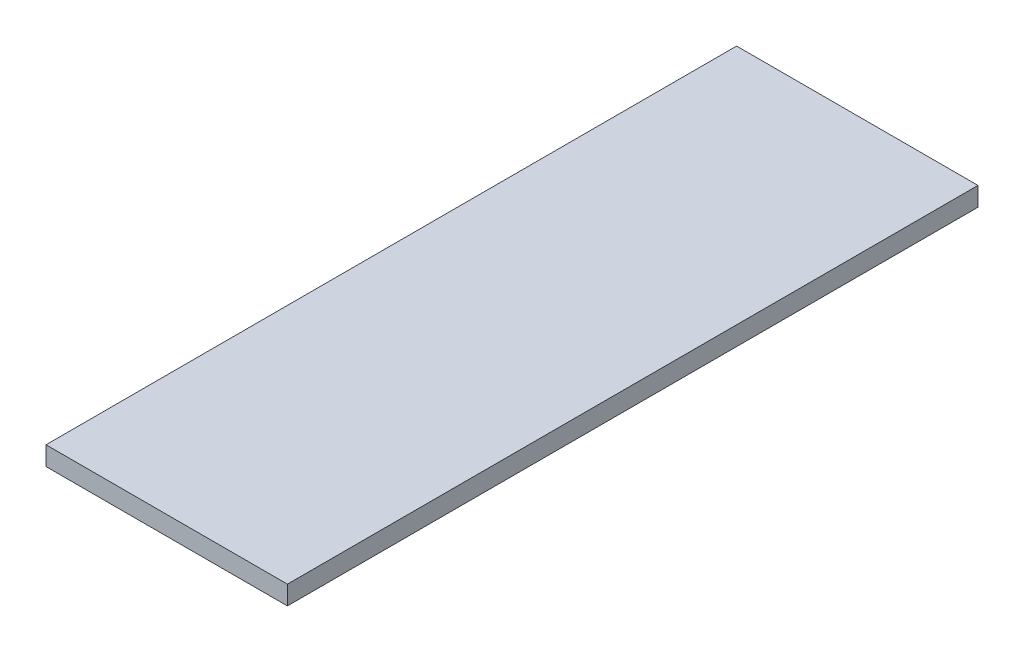
ISO-10303-21;
HEADER;
FILE_DESCRIPTION(('STEP AP214'),'2;1');
FILE_NAME('part.step','',(''),(''),'','','');
FILE_SCHEMA(('AUTOMOTIVE_DESIGN { 1 0 10303 214 1 1 1 1 }'));
ENDSEC;
DATA;
#1=APPLICATION_CONTEXT('core data for automotive mechanical design processes');
#2=APPLICATION_PROTOCOL_DEFINITION('international standard','automotive_design',2000,#1);
#3=PRODUCT_CONTEXT('',#1,'mechanical');
#4=PRODUCT('Part','Part','',(#3));
#5=PRODUCT_RELATED_PRODUCT_CATEGORY('part','',(#4));
#6=PRODUCT_DEFINITION_FORMATION('','',#4);
#7=PRODUCT_DEFINITION_CONTEXT('part definition',#1,'design');
#8=PRODUCT_DEFINITION('design','',#6,#7);
#9=PRODUCT_DEFINITION_SHAPE('','',#8);
#10=(LENGTH_UNIT() NAMED_UNIT(*) SI_UNIT(.MILLI.,.METRE.));
#11=(NAMED_UNIT(*) PLANE_ANGLE_UNIT() SI_UNIT($,.RADIAN.));
#12=(NAMED_UNIT(*) SI_UNIT($,.STERADIAN.) SOLID_ANGLE_UNIT());
#13=UNCERTAINTY_MEASURE_WITH_UNIT(LENGTH_MEASURE(1.E-05),#10,'distance_accuracy_value','');
#14=(GEOMETRIC_REPRESENTATION_CONTEXT(3) GLOBAL_UNCERTAINTY_ASSIGNED_CONTEXT((#13)) GLOBAL_UNIT_ASSIGNED_CONTEXT((#10,
#11,#12)) REPRESENTATION_CONTEXT('',''));
#15=CARTESIAN_POINT('',(0.,0.,0.));
#16=DIRECTION('',(0.,0.,1.));
#17=DIRECTION('',(1.,0.,0.));
#18=AXIS2_PLACEMENT_3D('',#15,#16,#17);
#19=CARTESIAN_POINT('',(18.,22.86,-650.));
#20=DIRECTION('',(1.,0.,0.));
#21=DIRECTION('',(0.,0.,-1.));
#22=AXIS2_PLACEMENT_3D('',#19,#20,#21);
#23=PLANE('',#22);
#24=DIRECTION('',(0.,1.,0.));
#25=VECTOR('',#24,1.);
#26=CARTESIAN_POINT('',(18.,22.86,0.));
#27=LINE('',#26,#25);
#28=CARTESIAN_POINT('',(18.,22.86,0.));
#29=VERTEX_POINT('',#28);
#30=CARTESIAN_POINT('',(18.,40.86,0.));
#31=VERTEX_POINT('',#30);
#32=EDGE_CURVE('E77',#29,#31,#27,.T.);
#33=ORIENTED_EDGE('',*,*,#32,.F.);
#34=DIRECTION('',(0.,0.,1.));
#35=VECTOR('',#34,1.);
#36=CARTESIAN_POINT('',(18.,22.86,-650.));
#37=LINE('',#36,#35);
#38=CARTESIAN_POINT('',(18.,22.86,-657.999999999975));
#39=VERTEX_POINT('',#38);
#40=EDGE_CURVE('E11',#39,#29,#37,.T.);
#41=ORIENTED_EDGE('',*,*,#40,.F.);
#42=DIRECTION('',(0.,1.,0.));
#43=VECTOR('',#42,1.);
#44=CARTESIAN_POINT('',(18.,22.86,-657.999999999975));
#45=LINE('',#44,#43);
#46=CARTESIAN_POINT('',(18.,40.86,-657.999999999975));
#47=VERTEX_POINT('',#46);
#48=EDGE_CURVE('E75',#39,#47,#45,.T.);
#49=ORIENTED_EDGE('',*,*,#48,.T.);
#50=DIRECTION('',(0.,0.,1.));
#51=VECTOR('',#50,1.);
#52=CARTESIAN_POINT('',(18.,40.86,-650.));
#53=LINE('',#52,#51);
#54=EDGE_CURVE('E37',#47,#31,#53,.T.);
#55=ORIENTED_EDGE('',*,*,#54,.T.);
#56=EDGE_LOOP('',(#33,#41,#49,#55));
#57=FACE_BOUND('',#56,.T.);
#58=ADVANCED_FACE('F34',(#57),#23,.T.);
#59=CARTESIAN_POINT('',(18.,22.86,-650.));
#60=DIRECTION('',(0.,-1.,0.));
#61=DIRECTION('',(1.,0.,0.));
#62=AXIS2_PLACEMENT_3D('',#59,#60,#61);
#63=PLANE('',#62);
#64=DIRECTION('',(1.,0.,0.));
#65=VECTOR('',#64,1.);
#66=CARTESIAN_POINT('',(18.,22.86,0.));
#67=LINE('',#66,#65);
#68=CARTESIAN_POINT('',(-212.,22.86,0.));
#69=VERTEX_POINT('',#68);
#70=EDGE_CURVE('E100',#69,#29,#67,.T.);
#71=ORIENTED_EDGE('',*,*,#70,.F.);
#72=DIRECTION('',(0.,0.,1.));
#73=VECTOR('',#72,1.);
#74=CARTESIAN_POINT('',(-212.,22.86,-650.));
#75=LINE('',#74,#73);
#76=CARTESIAN_POINT('',(-212.,22.86,-657.999999999975));
#77=VERTEX_POINT('',#76);
#78=EDGE_CURVE('E42',#77,#69,#75,.T.);
#79=ORIENTED_EDGE('',*,*,#78,.F.);
#80=DIRECTION('',(1.,0.,0.));
#81=VECTOR('',#80,1.);
#82=CARTESIAN_POINT('',(-212.,22.86,-657.999999999975));
#83=LINE('',#82,#81);
#84=EDGE_CURVE('E84',#77,#39,#83,.T.);
#85=ORIENTED_EDGE('',*,*,#84,.T.);
#86=ORIENTED_EDGE('',*,*,#40,.T.);
#87=EDGE_LOOP('',(#71,#79,#85,#86));
#88=FACE_BOUND('',#87,.T.);
#89=ADVANCED_FACE('F88',(#88),#63,.T.);
#90=CARTESIAN_POINT('',(-212.,22.86,-650.));
#91=DIRECTION('',(-1.,0.,0.));
#92=DIRECTION('',(0.,0.,1.));
#93=AXIS2_PLACEMENT_3D('',#90,#91,#92);
#94=PLANE('',#93);
#95=DIRECTION('',(0.,-1.,0.));
#96=VECTOR('',#95,1.);
#97=CARTESIAN_POINT('',(-212.,22.86,0.));
#98=LINE('',#97,#96);
#99=CARTESIAN_POINT('',(-212.,40.86,0.));
#100=VERTEX_POINT('',#99);
#101=EDGE_CURVE('E98',#100,#69,#98,.T.);
#102=ORIENTED_EDGE('',*,*,#101,.F.);
#103=DIRECTION('',(0.,0.,1.));
#104=VECTOR('',#103,1.);
#105=CARTESIAN_POINT('',(-212.,40.86,-650.));
#106=LINE('',#105,#104);
#107=CARTESIAN_POINT('',(-212.,40.86,-657.999999999975));
#108=VERTEX_POINT('',#107);
#109=EDGE_CURVE('E102',#108,#100,#106,.T.);
#110=ORIENTED_EDGE('',*,*,#109,.F.);
#111=DIRECTION('',(0.,-1.,0.));
#112=VECTOR('',#111,1.);
#113=CARTESIAN_POINT('',(-212.,22.86,-657.999999999975));
#114=LINE('',#113,#112);
#115=EDGE_CURVE('E92',#108,#77,#114,.T.);
#116=ORIENTED_EDGE('',*,*,#115,.T.);
#117=ORIENTED_EDGE('',*,*,#78,.T.);
#118=EDGE_LOOP('',(#102,#110,#116,#117));
#119=FACE_BOUND('',#118,.T.);
#120=ADVANCED_FACE('F108',(#119),#94,.T.);
#121=CARTESIAN_POINT('',(18.,40.86,-650.));
#122=DIRECTION('',(0.,1.,0.));
#123=DIRECTION('',(-1.,0.,0.));
#124=AXIS2_PLACEMENT_3D('',#121,#122,#123);
#125=PLANE('',#124);
#126=DIRECTION('',(-1.,0.,0.));
#127=VECTOR('',#126,1.);
#128=CARTESIAN_POINT('',(18.,40.86,0.));
#129=LINE('',#128,#127);
#130=EDGE_CURVE('E95',#31,#100,#129,.T.);
#131=ORIENTED_EDGE('',*,*,#130,.F.);
#132=ORIENTED_EDGE('',*,*,#54,.F.);
#133=DIRECTION('',(-1.,0.,0.));
#134=VECTOR('',#133,1.);
#135=CARTESIAN_POINT('',(-212.,40.86,-657.999999999975));
#136=LINE('',#135,#134);
#137=EDGE_CURVE('E86',#47,#108,#136,.T.);
#138=ORIENTED_EDGE('',*,*,#137,.T.);
#139=ORIENTED_EDGE('',*,*,#109,.T.);
#140=EDGE_LOOP('',(#131,#132,#138,#139));
#141=FACE_BOUND('',#140,.T.);
#142=ADVANCED_FACE('F105',(#141),#125,.T.);
#143=CARTESIAN_POINT('',(0.,0.,0.));
#144=DIRECTION('',(0.,0.,1.));
#145=DIRECTION('',(1.,0.,0.));
#146=AXIS2_PLACEMENT_3D('',#143,#144,#145);
#147=PLANE('',#146);
#148=ORIENTED_EDGE('',*,*,#32,.T.);
#149=ORIENTED_EDGE('',*,*,#130,.T.);
#150=ORIENTED_EDGE('',*,*,#101,.T.);
#151=ORIENTED_EDGE('',*,*,#70,.T.);
#152=EDGE_LOOP('',(#148,#149,#150,#151));
#153=FACE_BOUND('',#152,.T.);
#154=ADVANCED_FACE('F107',(#153),#147,.T.);
#155=CARTESIAN_POINT('',(-12.7000000000002,-10.5,-657.999999999975));
#156=DIRECTION('',(0.,0.,1.));
#157=DIRECTION('',(0.,1.,0.));
#158=AXIS2_PLACEMENT_3D('',#155,#156,#157);
#159=PLANE('',#158);
#160=ORIENTED_EDGE('',*,*,#137,.F.);
#161=ORIENTED_EDGE('',*,*,#48,.F.);
#162=ORIENTED_EDGE('',*,*,#84,.F.);
#163=ORIENTED_EDGE('',*,*,#115,.F.);
#164=EDGE_LOOP('',(#160,#161,#162,#163));
#165=FACE_BOUND('',#164,.T.);
#166=ADVANCED_FACE('F82',(#165),#159,.F.);
#167=CLOSED_SHELL('',(#58,#89,#120,#142,#154,#166));
#168=MANIFOLD_SOLID_BREP('B2',#167);
#169=ADVANCED_BREP_SHAPE_REPRESENTATION('',(#18,#168),#14);
#170=SHAPE_DEFINITION_REPRESENTATION(#9,#169);
ENDSEC;
END-ISO-10303-21;
